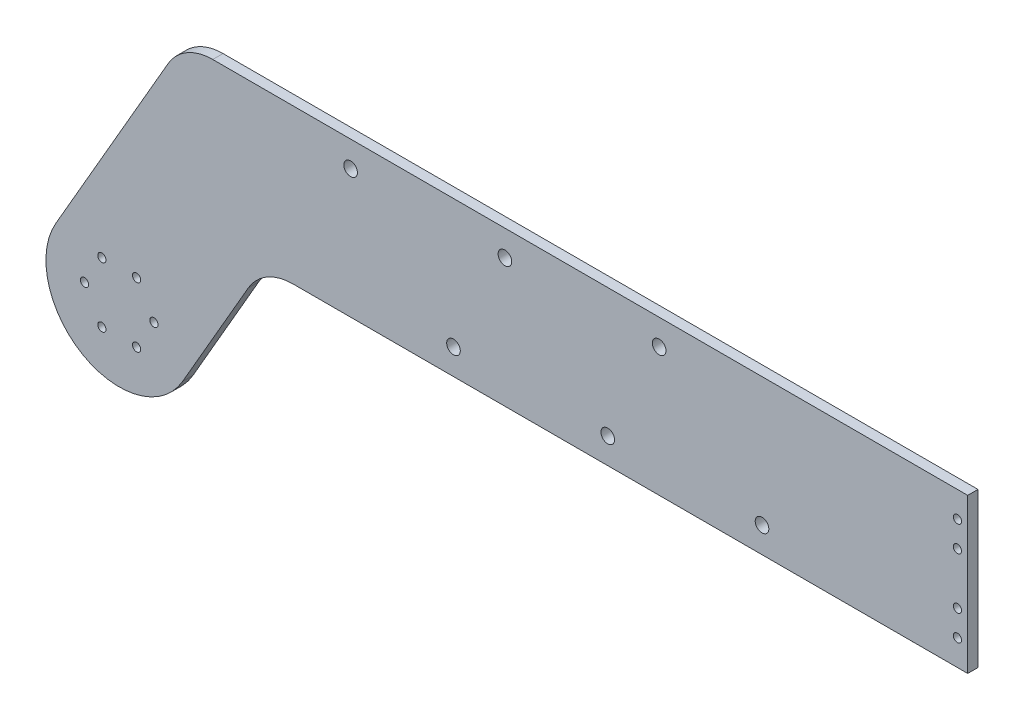
ISO-10303-21;
HEADER;
FILE_DESCRIPTION(('STEP AP214'),'2;1');
FILE_NAME('part.step','',(''),(''),'','','');
FILE_SCHEMA(('AUTOMOTIVE_DESIGN { 1 0 10303 214 1 1 1 1 }'));
ENDSEC;
DATA;
#1=APPLICATION_CONTEXT('core data for automotive mechanical design processes');
#2=APPLICATION_PROTOCOL_DEFINITION('international standard','automotive_design',2000,#1);
#3=PRODUCT_CONTEXT('',#1,'mechanical');
#4=PRODUCT('Part','Part','',(#3));
#5=PRODUCT_RELATED_PRODUCT_CATEGORY('part','',(#4));
#6=PRODUCT_DEFINITION_FORMATION('','',#4);
#7=PRODUCT_DEFINITION_CONTEXT('part definition',#1,'design');
#8=PRODUCT_DEFINITION('design','',#6,#7);
#9=PRODUCT_DEFINITION_SHAPE('','',#8);
#10=(LENGTH_UNIT() NAMED_UNIT(*) SI_UNIT(.MILLI.,.METRE.));
#11=(NAMED_UNIT(*) PLANE_ANGLE_UNIT() SI_UNIT($,.RADIAN.));
#12=(NAMED_UNIT(*) SI_UNIT($,.STERADIAN.) SOLID_ANGLE_UNIT());
#13=UNCERTAINTY_MEASURE_WITH_UNIT(LENGTH_MEASURE(1.E-05),#10,'distance_accuracy_value','');
#14=(GEOMETRIC_REPRESENTATION_CONTEXT(3) GLOBAL_UNCERTAINTY_ASSIGNED_CONTEXT((#13)) GLOBAL_UNIT_ASSIGNED_CONTEXT((#10,
#11,#12)) REPRESENTATION_CONTEXT('',''));
#15=CARTESIAN_POINT('',(0.,0.,0.));
#16=DIRECTION('',(0.,0.,1.));
#17=DIRECTION('',(1.,0.,0.));
#18=AXIS2_PLACEMENT_3D('',#15,#16,#17);
#19=CARTESIAN_POINT('',(150.75,35.75,4.));
#20=DIRECTION('',(0.,0.,1.));
#21=DIRECTION('',(1.,0.,0.));
#22=AXIS2_PLACEMENT_3D('',#19,#20,#21);
#23=PLANE('',#22);
#24=CARTESIAN_POINT('',(-13.5,0.,4.));
#25=DIRECTION('',(0.,0.,-1.));
#26=DIRECTION('',(1.,0.,0.));
#27=AXIS2_PLACEMENT_3D('',#24,#25,#26);
#28=CIRCLE('',#27,1.6);
#29=CARTESIAN_POINT('',(-15.1,0.,4.));
#30=VERTEX_POINT('',#29);
#31=EDGE_CURVE('E309',#30,#30,#28,.T.);
#32=ORIENTED_EDGE('',*,*,#31,.T.);
#33=EDGE_LOOP('',(#32));
#34=FACE_BOUND('',#33,.T.);
#35=CARTESIAN_POINT('',(-6.75,-11.6913429510899,4.));
#36=DIRECTION('',(0.,0.,-1.));
#37=DIRECTION('',(1.,0.,0.));
#38=AXIS2_PLACEMENT_3D('',#35,#36,#37);
#39=CIRCLE('',#38,1.6);
#40=CARTESIAN_POINT('',(-8.35,-11.6913429510899,4.));
#41=VERTEX_POINT('',#40);
#42=EDGE_CURVE('E448',#41,#41,#39,.T.);
#43=ORIENTED_EDGE('',*,*,#42,.T.);
#44=EDGE_LOOP('',(#43));
#45=FACE_BOUND('',#44,.T.);
#46=CARTESIAN_POINT('',(6.75,-11.6913429510899,4.));
#47=DIRECTION('',(0.,0.,-1.));
#48=DIRECTION('',(1.,0.,0.));
#49=AXIS2_PLACEMENT_3D('',#46,#47,#48);
#50=CIRCLE('',#49,1.6);
#51=CARTESIAN_POINT('',(5.15,-11.6913429510899,4.));
#52=VERTEX_POINT('',#51);
#53=EDGE_CURVE('E480',#52,#52,#50,.T.);
#54=ORIENTED_EDGE('',*,*,#53,.T.);
#55=EDGE_LOOP('',(#54));
#56=FACE_BOUND('',#55,.T.);
#57=CARTESIAN_POINT('',(13.5,0.,4.));
#58=DIRECTION('',(0.,0.,-1.));
#59=DIRECTION('',(1.,0.,0.));
#60=AXIS2_PLACEMENT_3D('',#57,#58,#59);
#61=CIRCLE('',#60,1.6);
#62=CARTESIAN_POINT('',(11.9,0.,4.));
#63=VERTEX_POINT('',#62);
#64=EDGE_CURVE('E473',#63,#63,#61,.T.);
#65=ORIENTED_EDGE('',*,*,#64,.T.);
#66=EDGE_LOOP('',(#65));
#67=FACE_BOUND('',#66,.T.);
#68=CARTESIAN_POINT('',(6.75,11.6913429510899,4.));
#69=DIRECTION('',(0.,0.,-1.));
#70=DIRECTION('',(1.,0.,0.));
#71=AXIS2_PLACEMENT_3D('',#68,#69,#70);
#72=CIRCLE('',#71,1.6);
#73=CARTESIAN_POINT('',(5.15,11.6913429510899,4.));
#74=VERTEX_POINT('',#73);
#75=EDGE_CURVE('E335',#74,#74,#72,.T.);
#76=ORIENTED_EDGE('',*,*,#75,.T.);
#77=EDGE_LOOP('',(#76));
#78=FACE_BOUND('',#77,.T.);
#79=CARTESIAN_POINT('',(-6.75,11.6913429510899,4.));
#80=DIRECTION('',(0.,0.,-1.));
#81=DIRECTION('',(1.,0.,0.));
#82=AXIS2_PLACEMENT_3D('',#79,#80,#81);
#83=CIRCLE('',#82,1.6);
#84=CARTESIAN_POINT('',(-8.35,11.6913429510899,4.));
#85=VERTEX_POINT('',#84);
#86=EDGE_CURVE('E356',#85,#85,#83,.T.);
#87=ORIENTED_EDGE('',*,*,#86,.T.);
#88=EDGE_LOOP('',(#87));
#89=FACE_BOUND('',#88,.T.);
#90=CARTESIAN_POINT('',(326.,50.,4.));
#91=DIRECTION('',(0.,0.,-1.));
#92=DIRECTION('',(1.,0.,0.));
#93=AXIS2_PLACEMENT_3D('',#90,#91,#92);
#94=CIRCLE('',#93,1.6);
#95=CARTESIAN_POINT('',(324.4,50.,4.));
#96=VERTEX_POINT('',#95);
#97=EDGE_CURVE('E368',#96,#96,#94,.T.);
#98=ORIENTED_EDGE('',*,*,#97,.T.);
#99=EDGE_LOOP('',(#98));
#100=FACE_BOUND('',#99,.T.);
#101=CARTESIAN_POINT('',(326.,60.,4.));
#102=DIRECTION('',(0.,0.,-1.));
#103=DIRECTION('',(1.,0.,0.));
#104=AXIS2_PLACEMENT_3D('',#101,#102,#103);
#105=CIRCLE('',#104,1.6);
#106=CARTESIAN_POINT('',(324.4,60.,4.));
#107=VERTEX_POINT('',#106);
#108=EDGE_CURVE('E347',#107,#107,#105,.T.);
#109=ORIENTED_EDGE('',*,*,#108,.T.);
#110=EDGE_LOOP('',(#109));
#111=FACE_BOUND('',#110,.T.);
#112=CARTESIAN_POINT('',(326.,80.,4.));
#113=DIRECTION('',(0.,0.,-1.));
#114=DIRECTION('',(1.,0.,0.));
#115=AXIS2_PLACEMENT_3D('',#112,#113,#114);
#116=CIRCLE('',#115,1.6);
#117=CARTESIAN_POINT('',(324.4,80.,4.));
#118=VERTEX_POINT('',#117);
#119=EDGE_CURVE('E325',#118,#118,#116,.T.);
#120=ORIENTED_EDGE('',*,*,#119,.T.);
#121=EDGE_LOOP('',(#120));
#122=FACE_BOUND('',#121,.T.);
#123=CARTESIAN_POINT('',(326.,90.,4.));
#124=DIRECTION('',(0.,0.,-1.));
#125=DIRECTION('',(1.,0.,0.));
#126=AXIS2_PLACEMENT_3D('',#123,#124,#125);
#127=CIRCLE('',#126,1.6);
#128=CARTESIAN_POINT('',(324.4,90.,4.));
#129=VERTEX_POINT('',#128);
#130=EDGE_CURVE('E297',#129,#129,#127,.T.);
#131=ORIENTED_EDGE('',*,*,#130,.T.);
#132=EDGE_LOOP('',(#131));
#133=FACE_BOUND('',#132,.T.);
#134=CARTESIAN_POINT('',(90.,90.,4.));
#135=DIRECTION('',(0.,0.,-1.));
#136=DIRECTION('',(1.,0.,0.));
#137=AXIS2_PLACEMENT_3D('',#134,#135,#136);
#138=CIRCLE('',#137,2.65);
#139=CARTESIAN_POINT('',(87.35,90.,4.));
#140=VERTEX_POINT('',#139);
#141=EDGE_CURVE('E245',#140,#140,#138,.T.);
#142=ORIENTED_EDGE('',*,*,#141,.T.);
#143=EDGE_LOOP('',(#142));
#144=FACE_BOUND('',#143,.T.);
#145=CARTESIAN_POINT('',(150.,90.,4.));
#146=DIRECTION('',(0.,0.,-1.));
#147=DIRECTION('',(1.,0.,0.));
#148=AXIS2_PLACEMENT_3D('',#145,#146,#147);
#149=CIRCLE('',#148,2.65);
#150=CARTESIAN_POINT('',(147.35,90.,4.));
#151=VERTEX_POINT('',#150);
#152=EDGE_CURVE('E251',#151,#151,#149,.T.);
#153=ORIENTED_EDGE('',*,*,#152,.T.);
#154=EDGE_LOOP('',(#153));
#155=FACE_BOUND('',#154,.T.);
#156=CARTESIAN_POINT('',(210.,90.,4.));
#157=DIRECTION('',(0.,0.,-1.));
#158=DIRECTION('',(1.,0.,0.));
#159=AXIS2_PLACEMENT_3D('',#156,#157,#158);
#160=CIRCLE('',#159,2.65);
#161=CARTESIAN_POINT('',(207.35,90.,4.));
#162=VERTEX_POINT('',#161);
#163=EDGE_CURVE('E276',#162,#162,#160,.T.);
#164=ORIENTED_EDGE('',*,*,#163,.T.);
#165=EDGE_LOOP('',(#164));
#166=FACE_BOUND('',#165,.T.);
#167=CARTESIAN_POINT('',(190.,50.,4.));
#168=DIRECTION('',(0.,0.,-1.));
#169=DIRECTION('',(1.,0.,0.));
#170=AXIS2_PLACEMENT_3D('',#167,#168,#169);
#171=CIRCLE('',#170,2.65);
#172=CARTESIAN_POINT('',(187.35,50.,4.));
#173=VERTEX_POINT('',#172);
#174=EDGE_CURVE('E257',#173,#173,#171,.T.);
#175=ORIENTED_EDGE('',*,*,#174,.T.);
#176=EDGE_LOOP('',(#175));
#177=FACE_BOUND('',#176,.T.);
#178=CARTESIAN_POINT('',(130.,50.,4.));
#179=DIRECTION('',(0.,0.,-1.));
#180=DIRECTION('',(1.,0.,0.));
#181=AXIS2_PLACEMENT_3D('',#178,#179,#180);
#182=CIRCLE('',#181,2.65);
#183=CARTESIAN_POINT('',(127.35,50.,4.));
#184=VERTEX_POINT('',#183);
#185=EDGE_CURVE('E271',#184,#184,#182,.T.);
#186=ORIENTED_EDGE('',*,*,#185,.T.);
#187=EDGE_LOOP('',(#186));
#188=FACE_BOUND('',#187,.T.);
#189=CARTESIAN_POINT('',(250.,50.,4.));
#190=DIRECTION('',(0.,0.,-1.));
#191=DIRECTION('',(1.,0.,0.));
#192=AXIS2_PLACEMENT_3D('',#189,#190,#191);
#193=CIRCLE('',#192,2.65);
#194=CARTESIAN_POINT('',(247.35,50.,4.));
#195=VERTEX_POINT('',#194);
#196=EDGE_CURVE('E234',#195,#195,#193,.T.);
#197=ORIENTED_EDGE('',*,*,#196,.T.);
#198=EDGE_LOOP('',(#197));
#199=FACE_BOUND('',#198,.T.);
#200=CARTESIAN_POINT('',(36.3730669589464,80.,4.));
#201=DIRECTION('',(0.,0.,-1.));
#202=DIRECTION('',(-0.5,0.866025403784439,0.));
#203=AXIS2_PLACEMENT_3D('',#200,#201,#202);
#204=CIRCLE('',#203,20.);
#205=CARTESIAN_POINT('',(19.0525588832576,90.,4.));
#206=VERTEX_POINT('',#205);
#207=CARTESIAN_POINT('',(36.3730669589464,100.,4.));
#208=VERTEX_POINT('',#207);
#209=EDGE_CURVE('E419',#206,#208,#204,.T.);
#210=ORIENTED_EDGE('',*,*,#209,.F.);
#211=DIRECTION('',(-0.5,-0.866025403784439,0.));
#212=VECTOR('',#211,1.);
#213=CARTESIAN_POINT('',(24.8260615751539,100.,4.));
#214=LINE('',#213,#212);
#215=CARTESIAN_POINT('',(-24.6817240078565,14.25,4.));
#216=VERTEX_POINT('',#215);
#217=EDGE_CURVE('E26',#206,#216,#214,.T.);
#218=ORIENTED_EDGE('',*,*,#217,.T.);
#219=CARTESIAN_POINT('',(0.,0.,4.));
#220=DIRECTION('',(0.,0.,1.));
#221=DIRECTION('',(1.,0.,0.));
#222=AXIS2_PLACEMENT_3D('',#219,#220,#221);
#223=CIRCLE('',#222,28.5);
#224=CARTESIAN_POINT('',(24.6817240078565,-14.25,4.));
#225=VERTEX_POINT('',#224);
#226=EDGE_CURVE('E44',#216,#225,#223,.T.);
#227=ORIENTED_EDGE('',*,*,#226,.T.);
#228=DIRECTION('',(0.5,0.866025403784439,0.));
#229=VECTOR('',#228,1.);
#230=CARTESIAN_POINT('',(24.6817240078565,-14.25,4.));
#231=LINE('',#230,#229);
#232=CARTESIAN_POINT('',(50.2294734194974,30.,4.));
#233=VERTEX_POINT('',#232);
#234=EDGE_CURVE('E431',#225,#233,#231,.T.);
#235=ORIENTED_EDGE('',*,*,#234,.T.);
#236=CARTESIAN_POINT('',(67.5499814951862,20.,4.));
#237=DIRECTION('',(0.,0.,1.));
#238=DIRECTION('',(-0.5,0.866025403784438,0.));
#239=AXIS2_PLACEMENT_3D('',#236,#237,#238);
#240=CIRCLE('',#239,20.);
#241=CARTESIAN_POINT('',(67.5499814951862,40.,4.));
#242=VERTEX_POINT('',#241);
#243=EDGE_CURVE('E391',#242,#233,#240,.T.);
#244=ORIENTED_EDGE('',*,*,#243,.F.);
#245=DIRECTION('',(1.,0.,0.));
#246=VECTOR('',#245,1.);
#247=CARTESIAN_POINT('',(56.0029761113936,40.,4.));
#248=LINE('',#247,#246);
#249=CARTESIAN_POINT('',(330.,40.,4.));
#250=VERTEX_POINT('',#249);
#251=EDGE_CURVE('E401',#242,#250,#248,.T.);
#252=ORIENTED_EDGE('',*,*,#251,.T.);
#253=DIRECTION('',(0.,1.,0.));
#254=VECTOR('',#253,1.);
#255=CARTESIAN_POINT('',(330.,40.,4.));
#256=LINE('',#255,#254);
#257=CARTESIAN_POINT('',(330.,100.,4.));
#258=VERTEX_POINT('',#257);
#259=EDGE_CURVE('E11',#250,#258,#256,.T.);
#260=ORIENTED_EDGE('',*,*,#259,.T.);
#261=DIRECTION('',(-1.,0.,0.));
#262=VECTOR('',#261,1.);
#263=CARTESIAN_POINT('',(330.,100.,4.));
#264=LINE('',#263,#262);
#265=EDGE_CURVE('E369',#258,#208,#264,.T.);
#266=ORIENTED_EDGE('',*,*,#265,.T.);
#267=EDGE_LOOP('',(#210,#218,#227,#235,#244,#252,#260,#266));
#268=FACE_BOUND('',#267,.T.);
#269=ADVANCED_FACE('F17',(#34,#45,#56,#67,#78,#89,#100,#111,#122,#133,#144,#155,#166,#177,#188,
#199,#268),#23,.T.);
#270=CARTESIAN_POINT('',(330.,40.,0.));
#271=DIRECTION('',(1.,0.,0.));
#272=DIRECTION('',(0.,1.,0.));
#273=AXIS2_PLACEMENT_3D('',#270,#271,#272);
#274=PLANE('',#273);
#275=DIRECTION('',(0.,1.,0.));
#276=VECTOR('',#275,1.);
#277=CARTESIAN_POINT('',(330.,40.,0.));
#278=LINE('',#277,#276);
#279=CARTESIAN_POINT('',(330.,40.,0.));
#280=VERTEX_POINT('',#279);
#281=CARTESIAN_POINT('',(330.,100.,0.));
#282=VERTEX_POINT('',#281);
#283=EDGE_CURVE('E395',#280,#282,#278,.T.);
#284=ORIENTED_EDGE('',*,*,#283,.T.);
#285=DIRECTION('',(0.,0.,1.));
#286=VECTOR('',#285,1.);
#287=CARTESIAN_POINT('',(330.,100.,0.));
#288=LINE('',#287,#286);
#289=EDGE_CURVE('E360',#282,#258,#288,.T.);
#290=ORIENTED_EDGE('',*,*,#289,.T.);
#291=ORIENTED_EDGE('',*,*,#259,.F.);
#292=DIRECTION('',(0.,0.,1.));
#293=VECTOR('',#292,1.);
#294=CARTESIAN_POINT('',(330.,40.,0.));
#295=LINE('',#294,#293);
#296=EDGE_CURVE('E397',#280,#250,#295,.T.);
#297=ORIENTED_EDGE('',*,*,#296,.F.);
#298=EDGE_LOOP('',(#284,#290,#291,#297));
#299=FACE_BOUND('',#298,.T.);
#300=ADVANCED_FACE('F943',(#299),#274,.T.);
#301=CARTESIAN_POINT('',(24.8260615751539,100.,0.));
#302=DIRECTION('',(-0.866025403784439,0.5,0.));
#303=DIRECTION('',(0.,0.,1.));
#304=AXIS2_PLACEMENT_3D('',#301,#302,#303);
#305=PLANE('',#304);
#306=DIRECTION('',(0.,0.,1.));
#307=VECTOR('',#306,1.);
#308=CARTESIAN_POINT('',(19.0525588832576,90.,0.));
#309=LINE('',#308,#307);
#310=CARTESIAN_POINT('',(19.0525588832576,90.,0.));
#311=VERTEX_POINT('',#310);
#312=EDGE_CURVE('E396',#311,#206,#309,.T.);
#313=ORIENTED_EDGE('',*,*,#312,.F.);
#314=DIRECTION('',(-0.5,-0.866025403784439,0.));
#315=VECTOR('',#314,1.);
#316=CARTESIAN_POINT('',(24.8260615751539,100.,0.));
#317=LINE('',#316,#315);
#318=CARTESIAN_POINT('',(-24.6817240078565,14.25,0.));
#319=VERTEX_POINT('',#318);
#320=EDGE_CURVE('E361',#311,#319,#317,.T.);
#321=ORIENTED_EDGE('',*,*,#320,.T.);
#322=DIRECTION('',(0.,0.,1.));
#323=VECTOR('',#322,1.);
#324=CARTESIAN_POINT('',(-24.6817240078565,14.25,0.));
#325=LINE('',#324,#323);
#326=EDGE_CURVE('E412',#319,#216,#325,.T.);
#327=ORIENTED_EDGE('',*,*,#326,.T.);
#328=ORIENTED_EDGE('',*,*,#217,.F.);
#329=EDGE_LOOP('',(#313,#321,#327,#328));
#330=FACE_BOUND('',#329,.T.);
#331=ADVANCED_FACE('F19',(#330),#305,.T.);
#332=CARTESIAN_POINT('',(0.,0.,0.));
#333=DIRECTION('',(0.,0.,1.));
#334=DIRECTION('',(-0.5,-0.866025403784439,0.));
#335=AXIS2_PLACEMENT_3D('',#332,#333,#334);
#336=CYLINDRICAL_SURFACE('',#335,28.5);
#337=CARTESIAN_POINT('',(0.,0.,0.));
#338=DIRECTION('',(0.,0.,1.));
#339=DIRECTION('',(1.,0.,0.));
#340=AXIS2_PLACEMENT_3D('',#337,#338,#339);
#341=CIRCLE('',#340,28.5);
#342=CARTESIAN_POINT('',(24.6817240078565,-14.25,0.));
#343=VERTEX_POINT('',#342);
#344=EDGE_CURVE('E365',#319,#343,#341,.T.);
#345=ORIENTED_EDGE('',*,*,#344,.T.);
#346=DIRECTION('',(0.,0.,1.));
#347=VECTOR('',#346,1.);
#348=CARTESIAN_POINT('',(24.6817240078565,-14.25,0.));
#349=LINE('',#348,#347);
#350=EDGE_CURVE('E434',#343,#225,#349,.T.);
#351=ORIENTED_EDGE('',*,*,#350,.T.);
#352=ORIENTED_EDGE('',*,*,#226,.F.);
#353=ORIENTED_EDGE('',*,*,#326,.F.);
#354=EDGE_LOOP('',(#345,#351,#352,#353));
#355=FACE_BOUND('',#354,.T.);
#356=ADVANCED_FACE('F926',(#355),#336,.T.);
#357=CARTESIAN_POINT('',(24.6817240078565,-14.25,0.));
#358=DIRECTION('',(0.866025403784439,-0.5,0.));
#359=DIRECTION('',(0.,0.,-1.));
#360=AXIS2_PLACEMENT_3D('',#357,#358,#359);
#361=PLANE('',#360);
#362=DIRECTION('',(0.,0.,-1.));
#363=VECTOR('',#362,1.);
#364=CARTESIAN_POINT('',(50.2294734194974,30.,0.));
#365=LINE('',#364,#363);
#366=CARTESIAN_POINT('',(50.2294734194974,30.,0.));
#367=VERTEX_POINT('',#366);
#368=EDGE_CURVE('E406',#233,#367,#365,.T.);
#369=ORIENTED_EDGE('',*,*,#368,.F.);
#370=ORIENTED_EDGE('',*,*,#234,.F.);
#371=ORIENTED_EDGE('',*,*,#350,.F.);
#372=DIRECTION('',(0.5,0.866025403784439,0.));
#373=VECTOR('',#372,1.);
#374=CARTESIAN_POINT('',(24.6817240078565,-14.25,0.));
#375=LINE('',#374,#373);
#376=EDGE_CURVE('E441',#343,#367,#375,.T.);
#377=ORIENTED_EDGE('',*,*,#376,.T.);
#378=EDGE_LOOP('',(#369,#370,#371,#377));
#379=FACE_BOUND('',#378,.T.);
#380=ADVANCED_FACE('F916',(#379),#361,.T.);
#381=CARTESIAN_POINT('',(-13.5,0.,-376.854959269274));
#382=DIRECTION('',(0.,0.,1.));
#383=DIRECTION('',(1.,0.,0.));
#384=AXIS2_PLACEMENT_3D('',#381,#382,#383);
#385=CYLINDRICAL_SURFACE('',#384,1.6);
#386=ORIENTED_EDGE('',*,*,#31,.F.);
#387=DIRECTION('',(0.,0.,-1.));
#388=VECTOR('',#387,1.);
#389=CARTESIAN_POINT('',(-15.1,0.,-376.854959269274));
#390=LINE('',#389,#388);
#391=CARTESIAN_POINT('',(-15.1,0.,0.));
#392=VERTEX_POINT('',#391);
#393=EDGE_CURVE('E313',#30,#392,#390,.T.);
#394=ORIENTED_EDGE('',*,*,#393,.T.);
#395=CARTESIAN_POINT('',(-13.5,0.,0.));
#396=DIRECTION('',(0.,0.,1.));
#397=DIRECTION('',(1.,0.,0.));
#398=AXIS2_PLACEMENT_3D('',#395,#396,#397);
#399=CIRCLE('',#398,1.6);
#400=EDGE_CURVE('E330',#392,#392,#399,.T.);
#401=ORIENTED_EDGE('',*,*,#400,.F.);
#402=ORIENTED_EDGE('',*,*,#393,.F.);
#403=EDGE_LOOP('',(#386,#394,#401,#402));
#404=FACE_BOUND('',#403,.T.);
#405=ADVANCED_FACE('F906',(#404),#385,.F.);
#406=CARTESIAN_POINT('',(-6.75,-11.6913429510899,-376.854959269274));
#407=DIRECTION('',(0.,0.,1.));
#408=DIRECTION('',(1.,0.,0.));
#409=AXIS2_PLACEMENT_3D('',#406,#407,#408);
#410=CYLINDRICAL_SURFACE('',#409,1.6);
#411=ORIENTED_EDGE('',*,*,#42,.F.);
#412=DIRECTION('',(0.,0.,-1.));
#413=VECTOR('',#412,1.);
#414=CARTESIAN_POINT('',(-8.35,-11.6913429510899,-376.854959269274));
#415=LINE('',#414,#413);
#416=CARTESIAN_POINT('',(-8.35,-11.6913429510899,0.));
#417=VERTEX_POINT('',#416);
#418=EDGE_CURVE('E314',#41,#417,#415,.T.);
#419=ORIENTED_EDGE('',*,*,#418,.T.);
#420=CARTESIAN_POINT('',(-6.75,-11.6913429510899,0.));
#421=DIRECTION('',(0.,0.,1.));
#422=DIRECTION('',(1.,0.,0.));
#423=AXIS2_PLACEMENT_3D('',#420,#421,#422);
#424=CIRCLE('',#423,1.6);
#425=EDGE_CURVE('E326',#417,#417,#424,.T.);
#426=ORIENTED_EDGE('',*,*,#425,.F.);
#427=ORIENTED_EDGE('',*,*,#418,.F.);
#428=EDGE_LOOP('',(#411,#419,#426,#427));
#429=FACE_BOUND('',#428,.T.);
#430=ADVANCED_FACE('F896',(#429),#410,.F.);
#431=CARTESIAN_POINT('',(6.75,-11.6913429510899,-376.854959269274));
#432=DIRECTION('',(0.,0.,1.));
#433=DIRECTION('',(1.,0.,0.));
#434=AXIS2_PLACEMENT_3D('',#431,#432,#433);
#435=CYLINDRICAL_SURFACE('',#434,1.6);
#436=ORIENTED_EDGE('',*,*,#53,.F.);
#437=DIRECTION('',(0.,0.,-1.));
#438=VECTOR('',#437,1.);
#439=CARTESIAN_POINT('',(5.15,-11.6913429510899,-376.854959269274));
#440=LINE('',#439,#438);
#441=CARTESIAN_POINT('',(5.15,-11.6913429510899,0.));
#442=VERTEX_POINT('',#441);
#443=EDGE_CURVE('E484',#52,#442,#440,.T.);
#444=ORIENTED_EDGE('',*,*,#443,.T.);
#445=CARTESIAN_POINT('',(6.75,-11.6913429510899,0.));
#446=DIRECTION('',(0.,0.,1.));
#447=DIRECTION('',(1.,0.,0.));
#448=AXIS2_PLACEMENT_3D('',#445,#446,#447);
#449=CIRCLE('',#448,1.6);
#450=EDGE_CURVE('E268',#442,#442,#449,.T.);
#451=ORIENTED_EDGE('',*,*,#450,.F.);
#452=ORIENTED_EDGE('',*,*,#443,.F.);
#453=EDGE_LOOP('',(#436,#444,#451,#452));
#454=FACE_BOUND('',#453,.T.);
#455=ADVANCED_FACE('F885',(#454),#435,.F.);
#456=CARTESIAN_POINT('',(13.5,0.,-376.854959269274));
#457=DIRECTION('',(0.,0.,1.));
#458=DIRECTION('',(1.,0.,0.));
#459=AXIS2_PLACEMENT_3D('',#456,#457,#458);
#460=CYLINDRICAL_SURFACE('',#459,1.6);
#461=ORIENTED_EDGE('',*,*,#64,.F.);
#462=DIRECTION('',(0.,0.,-1.));
#463=VECTOR('',#462,1.);
#464=CARTESIAN_POINT('',(11.9,0.,-376.854959269274));
#465=LINE('',#464,#463);
#466=CARTESIAN_POINT('',(11.9,0.,0.));
#467=VERTEX_POINT('',#466);
#468=EDGE_CURVE('E477',#63,#467,#465,.T.);
#469=ORIENTED_EDGE('',*,*,#468,.T.);
#470=CARTESIAN_POINT('',(13.5,0.,0.));
#471=DIRECTION('',(0.,0.,1.));
#472=DIRECTION('',(1.,0.,0.));
#473=AXIS2_PLACEMENT_3D('',#470,#471,#472);
#474=CIRCLE('',#473,1.6);
#475=EDGE_CURVE('E263',#467,#467,#474,.T.);
#476=ORIENTED_EDGE('',*,*,#475,.F.);
#477=ORIENTED_EDGE('',*,*,#468,.F.);
#478=EDGE_LOOP('',(#461,#469,#476,#477));
#479=FACE_BOUND('',#478,.T.);
#480=ADVANCED_FACE('F875',(#479),#460,.F.);
#481=CARTESIAN_POINT('',(6.75,11.6913429510899,-376.854959269274));
#482=DIRECTION('',(0.,0.,1.));
#483=DIRECTION('',(1.,0.,0.));
#484=AXIS2_PLACEMENT_3D('',#481,#482,#483);
#485=CYLINDRICAL_SURFACE('',#484,1.6);
#486=ORIENTED_EDGE('',*,*,#75,.F.);
#487=DIRECTION('',(0.,0.,-1.));
#488=VECTOR('',#487,1.);
#489=CARTESIAN_POINT('',(5.15,11.6913429510899,-376.854959269274));
#490=LINE('',#489,#488);
#491=CARTESIAN_POINT('',(5.15,11.6913429510899,0.));
#492=VERTEX_POINT('',#491);
#493=EDGE_CURVE('E339',#74,#492,#490,.T.);
#494=ORIENTED_EDGE('',*,*,#493,.T.);
#495=CARTESIAN_POINT('',(6.75,11.6913429510899,0.));
#496=DIRECTION('',(0.,0.,1.));
#497=DIRECTION('',(1.,0.,0.));
#498=AXIS2_PLACEMENT_3D('',#495,#496,#497);
#499=CIRCLE('',#498,1.6);
#500=EDGE_CURVE('E267',#492,#492,#499,.T.);
#501=ORIENTED_EDGE('',*,*,#500,.F.);
#502=ORIENTED_EDGE('',*,*,#493,.F.);
#503=EDGE_LOOP('',(#486,#494,#501,#502));
#504=FACE_BOUND('',#503,.T.);
#505=ADVANCED_FACE('F866',(#504),#485,.F.);
#506=CARTESIAN_POINT('',(-6.75,11.6913429510899,-376.854959269274));
#507=DIRECTION('',(0.,0.,1.));
#508=DIRECTION('',(1.,0.,0.));
#509=AXIS2_PLACEMENT_3D('',#506,#507,#508);
#510=CYLINDRICAL_SURFACE('',#509,1.6);
#511=ORIENTED_EDGE('',*,*,#86,.F.);
#512=DIRECTION('',(0.,0.,-1.));
#513=VECTOR('',#512,1.);
#514=CARTESIAN_POINT('',(-8.35,11.6913429510899,-376.854959269274));
#515=LINE('',#514,#513);
#516=CARTESIAN_POINT('',(-8.35,11.6913429510899,0.));
#517=VERTEX_POINT('',#516);
#518=EDGE_CURVE('E340',#85,#517,#515,.T.);
#519=ORIENTED_EDGE('',*,*,#518,.T.);
#520=CARTESIAN_POINT('',(-6.75,11.6913429510899,0.));
#521=DIRECTION('',(0.,0.,1.));
#522=DIRECTION('',(1.,0.,0.));
#523=AXIS2_PLACEMENT_3D('',#520,#521,#522);
#524=CIRCLE('',#523,1.6);
#525=EDGE_CURVE('E372',#517,#517,#524,.T.);
#526=ORIENTED_EDGE('',*,*,#525,.F.);
#527=ORIENTED_EDGE('',*,*,#518,.F.);
#528=EDGE_LOOP('',(#511,#519,#526,#527));
#529=FACE_BOUND('',#528,.T.);
#530=ADVANCED_FACE('F856',(#529),#510,.F.);
#531=CARTESIAN_POINT('',(330.,100.,0.));
#532=DIRECTION('',(0.,1.,0.));
#533=DIRECTION('',(1.,0.,0.));
#534=AXIS2_PLACEMENT_3D('',#531,#532,#533);
#535=PLANE('',#534);
#536=DIRECTION('',(0.,0.,-1.));
#537=VECTOR('',#536,1.);
#538=CARTESIAN_POINT('',(36.3730669589464,100.,0.));
#539=LINE('',#538,#537);
#540=CARTESIAN_POINT('',(36.3730669589464,100.,0.));
#541=VERTEX_POINT('',#540);
#542=EDGE_CURVE('E423',#208,#541,#539,.T.);
#543=ORIENTED_EDGE('',*,*,#542,.F.);
#544=ORIENTED_EDGE('',*,*,#265,.F.);
#545=ORIENTED_EDGE('',*,*,#289,.F.);
#546=DIRECTION('',(-1.,0.,0.));
#547=VECTOR('',#546,1.);
#548=CARTESIAN_POINT('',(330.,100.,0.));
#549=LINE('',#548,#547);
#550=EDGE_CURVE('E392',#282,#541,#549,.T.);
#551=ORIENTED_EDGE('',*,*,#550,.T.);
#552=EDGE_LOOP('',(#543,#544,#545,#551));
#553=FACE_BOUND('',#552,.T.);
#554=ADVANCED_FACE('F847',(#553),#535,.T.);
#555=CARTESIAN_POINT('',(150.75,35.75,0.));
#556=DIRECTION('',(0.,0.,1.));
#557=DIRECTION('',(1.,0.,0.));
#558=AXIS2_PLACEMENT_3D('',#555,#556,#557);
#559=PLANE('',#558);
#560=ORIENTED_EDGE('',*,*,#525,.T.);
#561=EDGE_LOOP('',(#560));
#562=FACE_BOUND('',#561,.T.);
#563=ORIENTED_EDGE('',*,*,#500,.T.);
#564=EDGE_LOOP('',(#563));
#565=FACE_BOUND('',#564,.T.);
#566=ORIENTED_EDGE('',*,*,#475,.T.);
#567=EDGE_LOOP('',(#566));
#568=FACE_BOUND('',#567,.T.);
#569=ORIENTED_EDGE('',*,*,#450,.T.);
#570=EDGE_LOOP('',(#569));
#571=FACE_BOUND('',#570,.T.);
#572=ORIENTED_EDGE('',*,*,#425,.T.);
#573=EDGE_LOOP('',(#572));
#574=FACE_BOUND('',#573,.T.);
#575=ORIENTED_EDGE('',*,*,#400,.T.);
#576=EDGE_LOOP('',(#575));
#577=FACE_BOUND('',#576,.T.);
#578=CARTESIAN_POINT('',(326.,50.,0.));
#579=DIRECTION('',(0.,0.,1.));
#580=DIRECTION('',(1.,0.,0.));
#581=AXIS2_PLACEMENT_3D('',#578,#579,#580);
#582=CIRCLE('',#581,1.6);
#583=CARTESIAN_POINT('',(324.4,50.,0.));
#584=VERTEX_POINT('',#583);
#585=EDGE_CURVE('E380',#584,#584,#582,.T.);
#586=ORIENTED_EDGE('',*,*,#585,.T.);
#587=EDGE_LOOP('',(#586));
#588=FACE_BOUND('',#587,.T.);
#589=CARTESIAN_POINT('',(326.,60.,0.));
#590=DIRECTION('',(0.,0.,1.));
#591=DIRECTION('',(1.,0.,0.));
#592=AXIS2_PLACEMENT_3D('',#589,#590,#591);
#593=CIRCLE('',#592,1.6);
#594=CARTESIAN_POINT('',(324.4,60.,0.));
#595=VERTEX_POINT('',#594);
#596=EDGE_CURVE('E355',#595,#595,#593,.T.);
#597=ORIENTED_EDGE('',*,*,#596,.T.);
#598=EDGE_LOOP('',(#597));
#599=FACE_BOUND('',#598,.T.);
#600=CARTESIAN_POINT('',(326.,80.,0.));
#601=DIRECTION('',(0.,0.,1.));
#602=DIRECTION('',(1.,0.,0.));
#603=AXIS2_PLACEMENT_3D('',#600,#601,#602);
#604=CIRCLE('',#603,1.6);
#605=CARTESIAN_POINT('',(324.4,80.,0.));
#606=VERTEX_POINT('',#605);
#607=EDGE_CURVE('E344',#606,#606,#604,.T.);
#608=ORIENTED_EDGE('',*,*,#607,.T.);
#609=EDGE_LOOP('',(#608));
#610=FACE_BOUND('',#609,.T.);
#611=CARTESIAN_POINT('',(326.,90.,0.));
#612=DIRECTION('',(0.,0.,1.));
#613=DIRECTION('',(1.,0.,0.));
#614=AXIS2_PLACEMENT_3D('',#611,#612,#613);
#615=CIRCLE('',#614,1.6);
#616=CARTESIAN_POINT('',(324.4,90.,0.));
#617=VERTEX_POINT('',#616);
#618=EDGE_CURVE('E322',#617,#617,#615,.T.);
#619=ORIENTED_EDGE('',*,*,#618,.T.);
#620=EDGE_LOOP('',(#619));
#621=FACE_BOUND('',#620,.T.);
#622=CARTESIAN_POINT('',(90.,90.,0.));
#623=DIRECTION('',(0.,0.,1.));
#624=DIRECTION('',(1.,0.,0.));
#625=AXIS2_PLACEMENT_3D('',#622,#623,#624);
#626=CIRCLE('',#625,2.65);
#627=CARTESIAN_POINT('',(87.35,90.,0.));
#628=VERTEX_POINT('',#627);
#629=EDGE_CURVE('E294',#628,#628,#626,.T.);
#630=ORIENTED_EDGE('',*,*,#629,.T.);
#631=EDGE_LOOP('',(#630));
#632=FACE_BOUND('',#631,.T.);
#633=CARTESIAN_POINT('',(150.,90.,0.));
#634=DIRECTION('',(0.,0.,1.));
#635=DIRECTION('',(1.,0.,0.));
#636=AXIS2_PLACEMENT_3D('',#633,#634,#635);
#637=CIRCLE('',#636,2.65);
#638=CARTESIAN_POINT('',(147.35,90.,0.));
#639=VERTEX_POINT('',#638);
#640=EDGE_CURVE('E250',#639,#639,#637,.T.);
#641=ORIENTED_EDGE('',*,*,#640,.T.);
#642=EDGE_LOOP('',(#641));
#643=FACE_BOUND('',#642,.T.);
#644=CARTESIAN_POINT('',(210.,90.,0.));
#645=DIRECTION('',(0.,0.,1.));
#646=DIRECTION('',(1.,0.,0.));
#647=AXIS2_PLACEMENT_3D('',#644,#645,#646);
#648=CIRCLE('',#647,2.65);
#649=CARTESIAN_POINT('',(207.35,90.,0.));
#650=VERTEX_POINT('',#649);
#651=EDGE_CURVE('E256',#650,#650,#648,.T.);
#652=ORIENTED_EDGE('',*,*,#651,.T.);
#653=EDGE_LOOP('',(#652));
#654=FACE_BOUND('',#653,.T.);
#655=CARTESIAN_POINT('',(190.,50.,0.));
#656=DIRECTION('',(0.,0.,1.));
#657=DIRECTION('',(1.,0.,0.));
#658=AXIS2_PLACEMENT_3D('',#655,#656,#657);
#659=CIRCLE('',#658,2.65);
#660=CARTESIAN_POINT('',(187.35,50.,0.));
#661=VERTEX_POINT('',#660);
#662=EDGE_CURVE('E291',#661,#661,#659,.T.);
#663=ORIENTED_EDGE('',*,*,#662,.T.);
#664=EDGE_LOOP('',(#663));
#665=FACE_BOUND('',#664,.T.);
#666=CARTESIAN_POINT('',(130.,50.,0.));
#667=DIRECTION('',(0.,0.,1.));
#668=DIRECTION('',(1.,0.,0.));
#669=AXIS2_PLACEMENT_3D('',#666,#667,#668);
#670=CIRCLE('',#669,2.65);
#671=CARTESIAN_POINT('',(127.35,50.,0.));
#672=VERTEX_POINT('',#671);
#673=EDGE_CURVE('E262',#672,#672,#670,.T.);
#674=ORIENTED_EDGE('',*,*,#673,.T.);
#675=EDGE_LOOP('',(#674));
#676=FACE_BOUND('',#675,.T.);
#677=CARTESIAN_POINT('',(250.,50.,0.));
#678=DIRECTION('',(0.,0.,1.));
#679=DIRECTION('',(1.,0.,0.));
#680=AXIS2_PLACEMENT_3D('',#677,#678,#679);
#681=CIRCLE('',#680,2.65);
#682=CARTESIAN_POINT('',(247.35,50.,0.));
#683=VERTEX_POINT('',#682);
#684=EDGE_CURVE('E235',#683,#683,#681,.T.);
#685=ORIENTED_EDGE('',*,*,#684,.T.);
#686=EDGE_LOOP('',(#685));
#687=FACE_BOUND('',#686,.T.);
#688=CARTESIAN_POINT('',(36.3730669589464,80.,0.));
#689=DIRECTION('',(0.,0.,1.));
#690=DIRECTION('',(-0.5,0.866025403784439,0.));
#691=AXIS2_PLACEMENT_3D('',#688,#689,#690);
#692=CIRCLE('',#691,20.);
#693=EDGE_CURVE('E427',#541,#311,#692,.T.);
#694=ORIENTED_EDGE('',*,*,#693,.F.);
#695=ORIENTED_EDGE('',*,*,#550,.F.);
#696=ORIENTED_EDGE('',*,*,#283,.F.);
#697=DIRECTION('',(1.,0.,0.));
#698=VECTOR('',#697,1.);
#699=CARTESIAN_POINT('',(56.0029761113936,40.,0.));
#700=LINE('',#699,#698);
#701=CARTESIAN_POINT('',(67.5499814951862,40.,0.));
#702=VERTEX_POINT('',#701);
#703=EDGE_CURVE('E402',#702,#280,#700,.T.);
#704=ORIENTED_EDGE('',*,*,#703,.F.);
#705=CARTESIAN_POINT('',(67.5499814951862,20.,0.));
#706=DIRECTION('',(0.,0.,-1.));
#707=DIRECTION('',(-0.5,0.866025403784438,0.));
#708=AXIS2_PLACEMENT_3D('',#705,#706,#707);
#709=CIRCLE('',#708,20.);
#710=EDGE_CURVE('E383',#367,#702,#709,.T.);
#711=ORIENTED_EDGE('',*,*,#710,.F.);
#712=ORIENTED_EDGE('',*,*,#376,.F.);
#713=ORIENTED_EDGE('',*,*,#344,.F.);
#714=ORIENTED_EDGE('',*,*,#320,.F.);
#715=EDGE_LOOP('',(#694,#695,#696,#704,#711,#712,#713,#714));
#716=FACE_BOUND('',#715,.T.);
#717=ADVANCED_FACE('F838',(#562,#565,#568,#571,#574,#577,#588,#599,#610,#621,#632,#643,#654,
#665,#676,#687,#716),#559,.F.);
#718=CARTESIAN_POINT('',(36.3730669589464,80.,0.));
#719=DIRECTION('',(0.,0.,1.));
#720=DIRECTION('',(-0.5,0.866025403784439,0.));
#721=AXIS2_PLACEMENT_3D('',#718,#719,#720);
#722=CYLINDRICAL_SURFACE('',#721,20.);
#723=ORIENTED_EDGE('',*,*,#209,.T.);
#724=ORIENTED_EDGE('',*,*,#542,.T.);
#725=ORIENTED_EDGE('',*,*,#693,.T.);
#726=ORIENTED_EDGE('',*,*,#312,.T.);
#727=EDGE_LOOP('',(#723,#724,#725,#726));
#728=FACE_BOUND('',#727,.T.);
#729=ADVANCED_FACE('F829',(#728),#722,.T.);
#730=CARTESIAN_POINT('',(56.0029761113936,40.,0.));
#731=DIRECTION('',(0.,-1.,0.));
#732=DIRECTION('',(0.,0.,-1.));
#733=AXIS2_PLACEMENT_3D('',#730,#731,#732);
#734=PLANE('',#733);
#735=DIRECTION('',(0.,0.,1.));
#736=VECTOR('',#735,1.);
#737=CARTESIAN_POINT('',(67.5499814951862,40.,0.));
#738=LINE('',#737,#736);
#739=EDGE_CURVE('E387',#702,#242,#738,.T.);
#740=ORIENTED_EDGE('',*,*,#739,.F.);
#741=ORIENTED_EDGE('',*,*,#703,.T.);
#742=ORIENTED_EDGE('',*,*,#296,.T.);
#743=ORIENTED_EDGE('',*,*,#251,.F.);
#744=EDGE_LOOP('',(#740,#741,#742,#743));
#745=FACE_BOUND('',#744,.T.);
#746=ADVANCED_FACE('F819',(#745),#734,.T.);
#747=CARTESIAN_POINT('',(67.5499814951862,20.,0.));
#748=DIRECTION('',(0.,0.,1.));
#749=DIRECTION('',(-0.5,0.866025403784438,0.));
#750=AXIS2_PLACEMENT_3D('',#747,#748,#749);
#751=CYLINDRICAL_SURFACE('',#750,20.);
#752=ORIENTED_EDGE('',*,*,#710,.T.);
#753=ORIENTED_EDGE('',*,*,#739,.T.);
#754=ORIENTED_EDGE('',*,*,#243,.T.);
#755=ORIENTED_EDGE('',*,*,#368,.T.);
#756=EDGE_LOOP('',(#752,#753,#754,#755));
#757=FACE_BOUND('',#756,.T.);
#758=ADVANCED_FACE('F808',(#757),#751,.F.);
#759=CARTESIAN_POINT('',(326.,50.,-376.854959269274));
#760=DIRECTION('',(0.,0.,1.));
#761=DIRECTION('',(1.,0.,0.));
#762=AXIS2_PLACEMENT_3D('',#759,#760,#761);
#763=CYLINDRICAL_SURFACE('',#762,1.6);
#764=ORIENTED_EDGE('',*,*,#97,.F.);
#765=DIRECTION('',(0.,0.,-1.));
#766=VECTOR('',#765,1.);
#767=CARTESIAN_POINT('',(324.4,50.,-376.854959269274));
#768=LINE('',#767,#766);
#769=EDGE_CURVE('E376',#96,#584,#768,.T.);
#770=ORIENTED_EDGE('',*,*,#769,.T.);
#771=ORIENTED_EDGE('',*,*,#585,.F.);
#772=ORIENTED_EDGE('',*,*,#769,.F.);
#773=EDGE_LOOP('',(#764,#770,#771,#772));
#774=FACE_BOUND('',#773,.T.);
#775=ADVANCED_FACE('F798',(#774),#763,.F.);
#776=CARTESIAN_POINT('',(326.,60.,-376.854959269274));
#777=DIRECTION('',(0.,0.,1.));
#778=DIRECTION('',(1.,0.,0.));
#779=AXIS2_PLACEMENT_3D('',#776,#777,#778);
#780=CYLINDRICAL_SURFACE('',#779,1.6);
#781=ORIENTED_EDGE('',*,*,#108,.F.);
#782=DIRECTION('',(0.,0.,-1.));
#783=VECTOR('',#782,1.);
#784=CARTESIAN_POINT('',(324.4,60.,-376.854959269274));
#785=LINE('',#784,#783);
#786=EDGE_CURVE('E351',#107,#595,#785,.T.);
#787=ORIENTED_EDGE('',*,*,#786,.T.);
#788=ORIENTED_EDGE('',*,*,#596,.F.);
#789=ORIENTED_EDGE('',*,*,#786,.F.);
#790=EDGE_LOOP('',(#781,#787,#788,#789));
#791=FACE_BOUND('',#790,.T.);
#792=ADVANCED_FACE('F788',(#791),#780,.F.);
#793=CARTESIAN_POINT('',(326.,80.,-376.854959269274));
#794=DIRECTION('',(0.,0.,1.));
#795=DIRECTION('',(1.,0.,0.));
#796=AXIS2_PLACEMENT_3D('',#793,#794,#795);
#797=CYLINDRICAL_SURFACE('',#796,1.6);
#798=ORIENTED_EDGE('',*,*,#119,.F.);
#799=DIRECTION('',(0.,0.,-1.));
#800=VECTOR('',#799,1.);
#801=CARTESIAN_POINT('',(324.4,80.,-376.854959269274));
#802=LINE('',#801,#800);
#803=EDGE_CURVE('E334',#118,#606,#802,.T.);
#804=ORIENTED_EDGE('',*,*,#803,.T.);
#805=ORIENTED_EDGE('',*,*,#607,.F.);
#806=ORIENTED_EDGE('',*,*,#803,.F.);
#807=EDGE_LOOP('',(#798,#804,#805,#806));
#808=FACE_BOUND('',#807,.T.);
#809=ADVANCED_FACE('F779',(#808),#797,.F.);
#810=CARTESIAN_POINT('',(326.,90.,-376.854959269274));
#811=DIRECTION('',(0.,0.,1.));
#812=DIRECTION('',(1.,0.,0.));
#813=AXIS2_PLACEMENT_3D('',#810,#811,#812);
#814=CYLINDRICAL_SURFACE('',#813,1.6);
#815=ORIENTED_EDGE('',*,*,#130,.F.);
#816=DIRECTION('',(0.,0.,-1.));
#817=VECTOR('',#816,1.);
#818=CARTESIAN_POINT('',(324.4,90.,-376.854959269274));
#819=LINE('',#818,#817);
#820=EDGE_CURVE('E318',#129,#617,#819,.T.);
#821=ORIENTED_EDGE('',*,*,#820,.T.);
#822=ORIENTED_EDGE('',*,*,#618,.F.);
#823=ORIENTED_EDGE('',*,*,#820,.F.);
#824=EDGE_LOOP('',(#815,#821,#822,#823));
#825=FACE_BOUND('',#824,.T.);
#826=ADVANCED_FACE('F768',(#825),#814,.F.);
#827=CARTESIAN_POINT('',(90.,90.,-376.854959269274));
#828=DIRECTION('',(0.,0.,1.));
#829=DIRECTION('',(1.,0.,0.));
#830=AXIS2_PLACEMENT_3D('',#827,#828,#829);
#831=CYLINDRICAL_SURFACE('',#830,2.65);
#832=ORIENTED_EDGE('',*,*,#141,.F.);
#833=DIRECTION('',(0.,0.,-1.));
#834=VECTOR('',#833,1.);
#835=CARTESIAN_POINT('',(87.35,90.,-376.854959269274));
#836=LINE('',#835,#834);
#837=EDGE_CURVE('E249',#140,#628,#836,.T.);
#838=ORIENTED_EDGE('',*,*,#837,.T.);
#839=ORIENTED_EDGE('',*,*,#629,.F.);
#840=ORIENTED_EDGE('',*,*,#837,.F.);
#841=EDGE_LOOP('',(#832,#838,#839,#840));
#842=FACE_BOUND('',#841,.T.);
#843=ADVANCED_FACE('F757',(#842),#831,.F.);
#844=CARTESIAN_POINT('',(150.,90.,-376.854959269274));
#845=DIRECTION('',(0.,0.,1.));
#846=DIRECTION('',(1.,0.,0.));
#847=AXIS2_PLACEMENT_3D('',#844,#845,#846);
#848=CYLINDRICAL_SURFACE('',#847,2.65);
#849=ORIENTED_EDGE('',*,*,#152,.F.);
#850=DIRECTION('',(0.,0.,-1.));
#851=VECTOR('',#850,1.);
#852=CARTESIAN_POINT('',(147.35,90.,-376.854959269274));
#853=LINE('',#852,#851);
#854=EDGE_CURVE('E255',#151,#639,#853,.T.);
#855=ORIENTED_EDGE('',*,*,#854,.T.);
#856=ORIENTED_EDGE('',*,*,#640,.F.);
#857=ORIENTED_EDGE('',*,*,#854,.F.);
#858=EDGE_LOOP('',(#849,#855,#856,#857));
#859=FACE_BOUND('',#858,.T.);
#860=ADVANCED_FACE('F747',(#859),#848,.F.);
#861=CARTESIAN_POINT('',(210.,90.,-376.854959269274));
#862=DIRECTION('',(0.,0.,1.));
#863=DIRECTION('',(1.,0.,0.));
#864=AXIS2_PLACEMENT_3D('',#861,#862,#863);
#865=CYLINDRICAL_SURFACE('',#864,2.65);
#866=ORIENTED_EDGE('',*,*,#163,.F.);
#867=DIRECTION('',(0.,0.,-1.));
#868=VECTOR('',#867,1.);
#869=CARTESIAN_POINT('',(207.35,90.,-376.854959269274));
#870=LINE('',#869,#868);
#871=EDGE_CURVE('E272',#162,#650,#870,.T.);
#872=ORIENTED_EDGE('',*,*,#871,.T.);
#873=ORIENTED_EDGE('',*,*,#651,.F.);
#874=ORIENTED_EDGE('',*,*,#871,.F.);
#875=EDGE_LOOP('',(#866,#872,#873,#874));
#876=FACE_BOUND('',#875,.T.);
#877=ADVANCED_FACE('F737',(#876),#865,.F.);
#878=CARTESIAN_POINT('',(190.,50.,-376.854959269274));
#879=DIRECTION('',(0.,0.,1.));
#880=DIRECTION('',(1.,0.,0.));
#881=AXIS2_PLACEMENT_3D('',#878,#879,#880);
#882=CYLINDRICAL_SURFACE('',#881,2.65);
#883=ORIENTED_EDGE('',*,*,#174,.F.);
#884=DIRECTION('',(0.,0.,-1.));
#885=VECTOR('',#884,1.);
#886=CARTESIAN_POINT('',(187.35,50.,-376.854959269274));
#887=LINE('',#886,#885);
#888=EDGE_CURVE('E261',#173,#661,#887,.T.);
#889=ORIENTED_EDGE('',*,*,#888,.T.);
#890=ORIENTED_EDGE('',*,*,#662,.F.);
#891=ORIENTED_EDGE('',*,*,#888,.F.);
#892=EDGE_LOOP('',(#883,#889,#890,#891));
#893=FACE_BOUND('',#892,.T.);
#894=ADVANCED_FACE('F727',(#893),#882,.F.);
#895=CARTESIAN_POINT('',(130.,50.,-376.854959269274));
#896=DIRECTION('',(0.,0.,1.));
#897=DIRECTION('',(1.,0.,0.));
#898=AXIS2_PLACEMENT_3D('',#895,#896,#897);
#899=CYLINDRICAL_SURFACE('',#898,2.65);
#900=ORIENTED_EDGE('',*,*,#185,.F.);
#901=DIRECTION('',(0.,0.,-1.));
#902=VECTOR('',#901,1.);
#903=CARTESIAN_POINT('',(127.35,50.,-376.854959269274));
#904=LINE('',#903,#902);
#905=EDGE_CURVE('E280',#184,#672,#904,.T.);
#906=ORIENTED_EDGE('',*,*,#905,.T.);
#907=ORIENTED_EDGE('',*,*,#673,.F.);
#908=ORIENTED_EDGE('',*,*,#905,.F.);
#909=EDGE_LOOP('',(#900,#906,#907,#908));
#910=FACE_BOUND('',#909,.T.);
#911=ADVANCED_FACE('F715',(#910),#899,.F.);
#912=CARTESIAN_POINT('',(250.,50.,-376.854959269274));
#913=DIRECTION('',(0.,0.,1.));
#914=DIRECTION('',(1.,0.,0.));
#915=AXIS2_PLACEMENT_3D('',#912,#913,#914);
#916=CYLINDRICAL_SURFACE('',#915,2.65);
#917=ORIENTED_EDGE('',*,*,#196,.F.);
#918=DIRECTION('',(0.,0.,-1.));
#919=VECTOR('',#918,1.);
#920=CARTESIAN_POINT('',(247.35,50.,-376.854959269274));
#921=LINE('',#920,#919);
#922=EDGE_CURVE('E231',#195,#683,#921,.T.);
#923=ORIENTED_EDGE('',*,*,#922,.T.);
#924=ORIENTED_EDGE('',*,*,#684,.F.);
#925=ORIENTED_EDGE('',*,*,#922,.F.);
#926=EDGE_LOOP('',(#917,#923,#924,#925));
#927=FACE_BOUND('',#926,.T.);
#928=ADVANCED_FACE('F233',(#927),#916,.F.);
#929=CLOSED_SHELL('',(#269,#300,#331,#356,#380,#405,#430,#455,#480,#505,#530,#554,#717,#729,
#746,#758,#775,#792,#809,#826,#843,#860,#877,#894,#911,#928));
#930=MANIFOLD_SOLID_BREP('B1',#929);
#931=ADVANCED_BREP_SHAPE_REPRESENTATION('',(#18,#930),#14);
#932=SHAPE_DEFINITION_REPRESENTATION(#9,#931);
ENDSEC;
END-ISO-10303-21;
